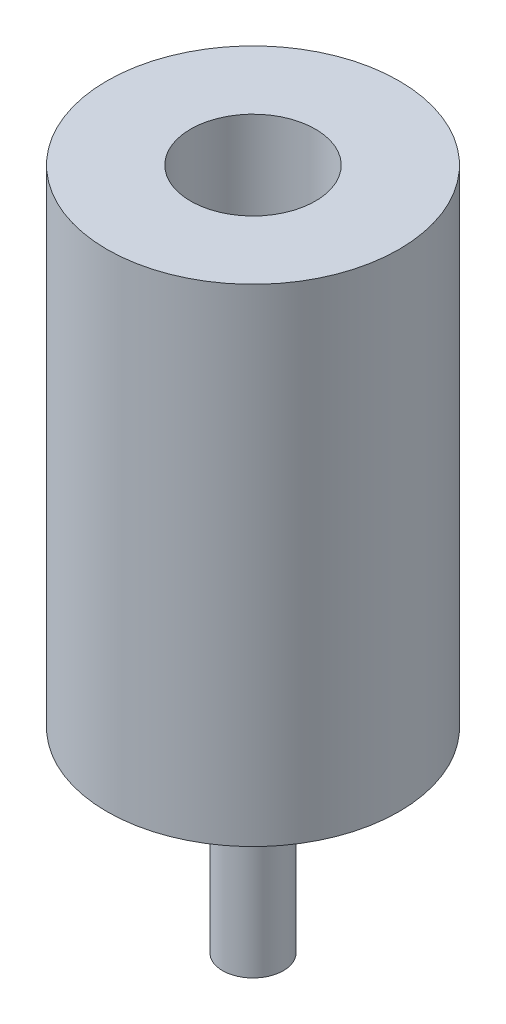
ISO-10303-21;
HEADER;
FILE_DESCRIPTION(('STEP AP214'),'2;1');
FILE_NAME('part.step','',(''),(''),'','','');
FILE_SCHEMA(('AUTOMOTIVE_DESIGN { 1 0 10303 214 1 1 1 1 }'));
ENDSEC;
DATA;
#1=APPLICATION_CONTEXT('core data for automotive mechanical design processes');
#2=APPLICATION_PROTOCOL_DEFINITION('international standard','automotive_design',2000,#1);
#3=PRODUCT_CONTEXT('',#1,'mechanical');
#4=PRODUCT('Part','Part','',(#3));
#5=PRODUCT_RELATED_PRODUCT_CATEGORY('part','',(#4));
#6=PRODUCT_DEFINITION_FORMATION('','',#4);
#7=PRODUCT_DEFINITION_CONTEXT('part definition',#1,'design');
#8=PRODUCT_DEFINITION('design','',#6,#7);
#9=PRODUCT_DEFINITION_SHAPE('','',#8);
#10=(LENGTH_UNIT() NAMED_UNIT(*) SI_UNIT(.MILLI.,.METRE.));
#11=(NAMED_UNIT(*) PLANE_ANGLE_UNIT() SI_UNIT($,.RADIAN.));
#12=(NAMED_UNIT(*) SI_UNIT($,.STERADIAN.) SOLID_ANGLE_UNIT());
#13=UNCERTAINTY_MEASURE_WITH_UNIT(LENGTH_MEASURE(1.E-05),#10,'distance_accuracy_value','');
#14=(GEOMETRIC_REPRESENTATION_CONTEXT(3) GLOBAL_UNCERTAINTY_ASSIGNED_CONTEXT((#13)) GLOBAL_UNIT_ASSIGNED_CONTEXT((#10,
#11,#12)) REPRESENTATION_CONTEXT('',''));
#15=CARTESIAN_POINT('',(0.,0.,0.));
#16=DIRECTION('',(0.,0.,1.));
#17=DIRECTION('',(1.,0.,0.));
#18=AXIS2_PLACEMENT_3D('',#15,#16,#17);
#19=CARTESIAN_POINT('',(-0.5009400192,-3.17999999,0.5009400192));
#20=DIRECTION('',(0.,-1.,0.));
#21=DIRECTION('',(0.,0.,-1.));
#22=AXIS2_PLACEMENT_3D('',#19,#20,#21);
#23=PLANE('',#22);
#24=CARTESIAN_POINT('',(0.,-3.17999999,0.));
#25=DIRECTION('',(0.,1.,0.));
#26=DIRECTION('',(-1.,0.,0.));
#27=AXIS2_PLACEMENT_3D('',#24,#25,#26);
#28=CIRCLE('',#27,0.495000026);
#29=CARTESIAN_POINT('',(-0.495000026,-3.17999999,0.));
#30=VERTEX_POINT('',#29);
#31=EDGE_CURVE('E18',#30,#30,#28,.F.);
#32=ORIENTED_EDGE('',*,*,#31,.T.);
#33=EDGE_LOOP('',(#32));
#34=FACE_BOUND('',#33,.T.);
#35=ADVANCED_FACE('F14',(#34),#23,.T.);
#36=CARTESIAN_POINT('',(0.,-3.17999999,0.));
#37=DIRECTION('',(0.,1.,0.));
#38=DIRECTION('',(-1.,0.,0.));
#39=AXIS2_PLACEMENT_3D('',#36,#37,#38);
#40=CYLINDRICAL_SURFACE('',#39,0.495000026);
#41=ORIENTED_EDGE('',*,*,#31,.F.);
#42=EDGE_LOOP('',(#41));
#43=FACE_BOUND('',#42,.T.);
#44=CARTESIAN_POINT('',(0.,0.,0.));
#45=DIRECTION('',(0.,1.,0.));
#46=DIRECTION('',(-1.,0.,0.));
#47=AXIS2_PLACEMENT_3D('',#44,#45,#46);
#48=CIRCLE('',#47,0.495000026);
#49=CARTESIAN_POINT('',(-0.495000026000002,0.,0.));
#50=VERTEX_POINT('',#49);
#51=EDGE_CURVE('E34',#50,#50,#48,.F.);
#52=ORIENTED_EDGE('',*,*,#51,.T.);
#53=EDGE_LOOP('',(#52));
#54=FACE_BOUND('',#53,.T.);
#55=ADVANCED_FACE('F42',(#43,#54),#40,.T.);
#56=CARTESIAN_POINT('',(-2.4034999936,0.,-2.4034999936));
#57=DIRECTION('',(0.,1.,0.));
#58=DIRECTION('',(0.,0.,1.));
#59=AXIS2_PLACEMENT_3D('',#56,#57,#58);
#60=PLANE('',#59);
#61=ORIENTED_EDGE('',*,*,#51,.F.);
#62=EDGE_LOOP('',(#61));
#63=FACE_BOUND('',#62,.T.);
#64=CARTESIAN_POINT('',(0.,0.,0.));
#65=DIRECTION('',(0.,-1.,0.));
#66=DIRECTION('',(0.,0.,-1.));
#67=AXIS2_PLACEMENT_3D('',#64,#65,#66);
#68=CIRCLE('',#67,2.3749999998);
#69=CARTESIAN_POINT('',(0.,0.,-2.3749999998));
#70=VERTEX_POINT('',#69);
#71=EDGE_CURVE('E32',#70,#70,#68,.T.);
#72=ORIENTED_EDGE('',*,*,#71,.T.);
#73=EDGE_LOOP('',(#72));
#74=FACE_BOUND('',#73,.T.);
#75=ADVANCED_FACE('F44',(#63,#74),#60,.F.);
#76=CARTESIAN_POINT('',(0.,7.9200000096,0.));
#77=DIRECTION('',(0.,-1.,0.));
#78=DIRECTION('',(0.,0.,-1.));
#79=AXIS2_PLACEMENT_3D('',#76,#77,#78);
#80=CYLINDRICAL_SURFACE('',#79,2.3749999998);
#81=ORIENTED_EDGE('',*,*,#71,.F.);
#82=EDGE_LOOP('',(#81));
#83=FACE_BOUND('',#82,.T.);
#84=CARTESIAN_POINT('',(0.,7.9200000096,0.));
#85=DIRECTION('',(0.,-1.,0.));
#86=DIRECTION('',(0.,0.,-1.));
#87=AXIS2_PLACEMENT_3D('',#84,#85,#86);
#88=CIRCLE('',#87,2.3749999998);
#89=CARTESIAN_POINT('',(0.,7.9200000096,-2.3749999998));
#90=VERTEX_POINT('',#89);
#91=EDGE_CURVE('E27',#90,#90,#88,.F.);
#92=ORIENTED_EDGE('',*,*,#91,.F.);
#93=EDGE_LOOP('',(#92));
#94=FACE_BOUND('',#93,.T.);
#95=ADVANCED_FACE('F51',(#83,#94),#80,.T.);
#96=CARTESIAN_POINT('',(-1.0271799878,1.5700000096,-1.0271799878));
#97=DIRECTION('',(0.,1.,0.));
#98=DIRECTION('',(0.,0.,1.));
#99=AXIS2_PLACEMENT_3D('',#96,#97,#98);
#100=PLANE('',#99);
#101=CARTESIAN_POINT('',(0.,1.5700000096,0.));
#102=DIRECTION('',(0.,1.,0.));
#103=DIRECTION('',(-1.,0.,0.));
#104=AXIS2_PLACEMENT_3D('',#101,#102,#103);
#105=CIRCLE('',#104,1.015000002);
#106=CARTESIAN_POINT('',(-1.015000002,1.5700000096,0.));
#107=VERTEX_POINT('',#106);
#108=EDGE_CURVE('E22',#107,#107,#105,.F.);
#109=ORIENTED_EDGE('',*,*,#108,.F.);
#110=EDGE_LOOP('',(#109));
#111=FACE_BOUND('',#110,.T.);
#112=ADVANCED_FACE('F62',(#111),#100,.T.);
#113=CARTESIAN_POINT('',(-2.4034999936,7.9200000096,-2.4034999936));
#114=DIRECTION('',(0.,1.,0.));
#115=DIRECTION('',(0.,0.,1.));
#116=AXIS2_PLACEMENT_3D('',#113,#114,#115);
#117=PLANE('',#116);
#118=CARTESIAN_POINT('',(0.,7.9200000096,0.));
#119=DIRECTION('',(0.,1.,0.));
#120=DIRECTION('',(-1.,0.,0.));
#121=AXIS2_PLACEMENT_3D('',#118,#119,#120);
#122=CIRCLE('',#121,1.015000002);
#123=CARTESIAN_POINT('',(-1.015000002,7.9200000096,0.));
#124=VERTEX_POINT('',#123);
#125=EDGE_CURVE('E10',#124,#124,#122,.T.);
#126=ORIENTED_EDGE('',*,*,#125,.F.);
#127=EDGE_LOOP('',(#126));
#128=FACE_BOUND('',#127,.T.);
#129=ORIENTED_EDGE('',*,*,#91,.T.);
#130=EDGE_LOOP('',(#129));
#131=FACE_BOUND('',#130,.T.);
#132=ADVANCED_FACE('F16',(#128,#131),#117,.T.);
#133=CARTESIAN_POINT('',(0.,1.5700000096,0.));
#134=DIRECTION('',(0.,1.,0.));
#135=DIRECTION('',(-1.,0.,0.));
#136=AXIS2_PLACEMENT_3D('',#133,#134,#135);
#137=CYLINDRICAL_SURFACE('',#136,1.015000002);
#138=ORIENTED_EDGE('',*,*,#125,.T.);
#139=EDGE_LOOP('',(#138));
#140=FACE_BOUND('',#139,.T.);
#141=ORIENTED_EDGE('',*,*,#108,.T.);
#142=EDGE_LOOP('',(#141));
#143=FACE_BOUND('',#142,.T.);
#144=ADVANCED_FACE('F56',(#140,#143),#137,.F.);
#145=CLOSED_SHELL('',(#35,#55,#75,#95,#112,#132,#144));
#146=MANIFOLD_SOLID_BREP('B1',#145);
#147=ADVANCED_BREP_SHAPE_REPRESENTATION('',(#18,#146),#14);
#148=SHAPE_DEFINITION_REPRESENTATION(#9,#147);
ENDSEC;
END-ISO-10303-21;
